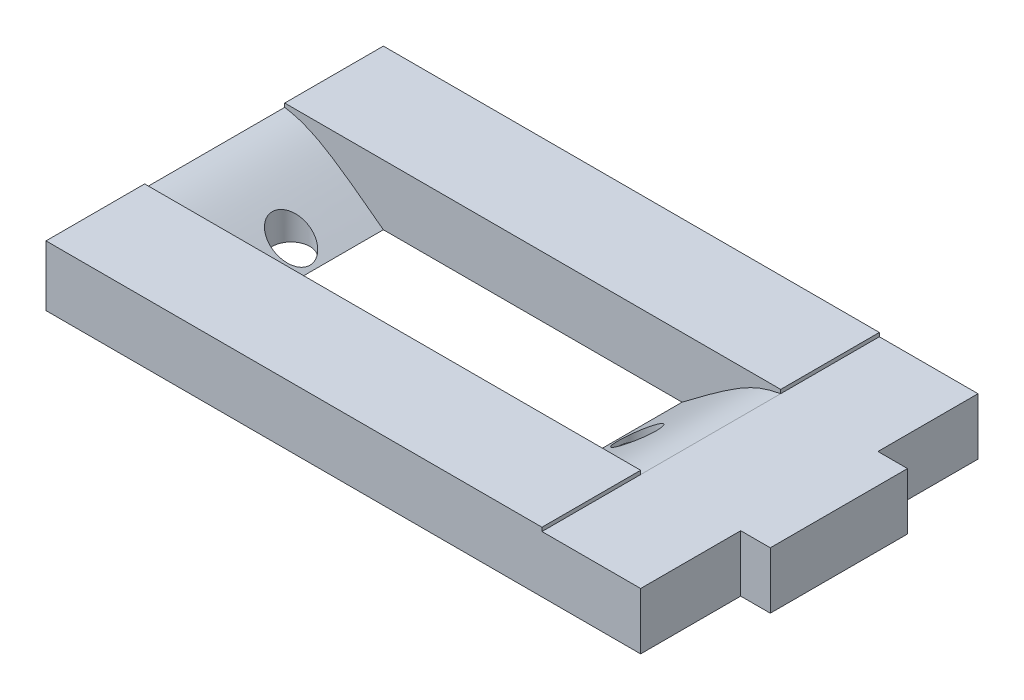
ISO-10303-21;
HEADER;
FILE_DESCRIPTION(('STEP AP214'),'2;1');
FILE_NAME('part.step','',(''),(''),'','','');
FILE_SCHEMA(('AUTOMOTIVE_DESIGN { 1 0 10303 214 1 1 1 1 }'));
ENDSEC;
DATA;
#1=APPLICATION_CONTEXT('core data for automotive mechanical design processes');
#2=APPLICATION_PROTOCOL_DEFINITION('international standard','automotive_design',2000,#1);
#3=PRODUCT_CONTEXT('',#1,'mechanical');
#4=PRODUCT('Part','Part','',(#3));
#5=PRODUCT_RELATED_PRODUCT_CATEGORY('part','',(#4));
#6=PRODUCT_DEFINITION_FORMATION('','',#4);
#7=PRODUCT_DEFINITION_CONTEXT('part definition',#1,'design');
#8=PRODUCT_DEFINITION('design','',#6,#7);
#9=PRODUCT_DEFINITION_SHAPE('','',#8);
#10=(LENGTH_UNIT() NAMED_UNIT(*) SI_UNIT(.MILLI.,.METRE.));
#11=(NAMED_UNIT(*) PLANE_ANGLE_UNIT() SI_UNIT($,.RADIAN.));
#12=(NAMED_UNIT(*) SI_UNIT($,.STERADIAN.) SOLID_ANGLE_UNIT());
#13=UNCERTAINTY_MEASURE_WITH_UNIT(LENGTH_MEASURE(1.E-05),#10,'distance_accuracy_value','');
#14=(GEOMETRIC_REPRESENTATION_CONTEXT(3) GLOBAL_UNCERTAINTY_ASSIGNED_CONTEXT((#13)) GLOBAL_UNIT_ASSIGNED_CONTEXT((#10,
#11,#12)) REPRESENTATION_CONTEXT('',''));
#15=CARTESIAN_POINT('',(0.,0.,0.));
#16=DIRECTION('',(0.,0.,1.));
#17=DIRECTION('',(1.,0.,0.));
#18=AXIS2_PLACEMENT_3D('',#15,#16,#17);
#19=CARTESIAN_POINT('',(35.14,0.,0.));
#20=DIRECTION('',(1.,0.,0.));
#21=DIRECTION('',(0.,0.,-1.));
#22=AXIS2_PLACEMENT_3D('',#19,#20,#21);
#23=PLANE('',#22);
#24=DIRECTION('',(0.,1.,0.));
#25=VECTOR('',#24,1.);
#26=CARTESIAN_POINT('',(35.14,5.74573636502059,-6.955));
#27=LINE('',#26,#25);
#28=CARTESIAN_POINT('',(35.14,0.,-6.955));
#29=VERTEX_POINT('',#28);
#30=CARTESIAN_POINT('',(35.14,5.74573636502059,-6.955));
#31=VERTEX_POINT('',#30);
#32=EDGE_CURVE('E215',#29,#31,#27,.T.);
#33=ORIENTED_EDGE('',*,*,#32,.F.);
#34=DIRECTION('',(0.,0.,-1.));
#35=VECTOR('',#34,1.);
#36=CARTESIAN_POINT('',(35.14,0.,17.1));
#37=LINE('',#36,#35);
#38=CARTESIAN_POINT('',(35.14,0.,-17.1));
#39=VERTEX_POINT('',#38);
#40=EDGE_CURVE('E227',#29,#39,#37,.T.);
#41=ORIENTED_EDGE('',*,*,#40,.T.);
#42=DIRECTION('',(0.,1.,0.));
#43=VECTOR('',#42,1.);
#44=CARTESIAN_POINT('',(35.14,0.,-17.1));
#45=LINE('',#44,#43);
#46=CARTESIAN_POINT('',(35.14,5.74573636502059,-17.1));
#47=VERTEX_POINT('',#46);
#48=EDGE_CURVE('E230',#39,#47,#45,.T.);
#49=ORIENTED_EDGE('',*,*,#48,.T.);
#50=DIRECTION('',(0.,0.,1.));
#51=VECTOR('',#50,1.);
#52=CARTESIAN_POINT('',(35.14,5.74573636502059,17.1));
#53=LINE('',#52,#51);
#54=EDGE_CURVE('E98',#47,#31,#53,.T.);
#55=ORIENTED_EDGE('',*,*,#54,.T.);
#56=EDGE_LOOP('',(#33,#41,#49,#55));
#57=FACE_BOUND('',#56,.T.);
#58=ADVANCED_FACE('F68',(#57),#23,.T.);
#59=DIRECTION('',(0.,-1.,0.));
#60=VECTOR('',#59,1.);
#61=CARTESIAN_POINT('',(35.14,5.74573636502059,6.955));
#62=LINE('',#61,#60);
#63=CARTESIAN_POINT('',(35.14,5.74573636502059,6.955));
#64=VERTEX_POINT('',#63);
#65=CARTESIAN_POINT('',(35.14,0.,6.955));
#66=VERTEX_POINT('',#65);
#67=EDGE_CURVE('E90',#64,#66,#62,.T.);
#68=ORIENTED_EDGE('',*,*,#67,.F.);
#69=CARTESIAN_POINT('',(35.14,5.74573636502059,17.1));
#70=VERTEX_POINT('',#69);
#71=EDGE_CURVE('E232',#64,#70,#53,.T.);
#72=ORIENTED_EDGE('',*,*,#71,.T.);
#73=DIRECTION('',(0.,-1.,0.));
#74=VECTOR('',#73,1.);
#75=CARTESIAN_POINT('',(35.14,0.,17.1));
#76=LINE('',#75,#74);
#77=CARTESIAN_POINT('',(35.14,0.,17.1));
#78=VERTEX_POINT('',#77);
#79=EDGE_CURVE('E224',#70,#78,#76,.T.);
#80=ORIENTED_EDGE('',*,*,#79,.T.);
#81=EDGE_CURVE('E228',#78,#66,#37,.T.);
#82=ORIENTED_EDGE('',*,*,#81,.T.);
#83=EDGE_LOOP('',(#68,#72,#80,#82));
#84=FACE_BOUND('',#83,.T.);
#85=ADVANCED_FACE('F431',(#84),#23,.T.);
#86=CARTESIAN_POINT('',(25.14,12.25,-7.1));
#87=DIRECTION('',(-1.,0.,0.));
#88=DIRECTION('',(0.,0.,1.));
#89=AXIS2_PLACEMENT_3D('',#86,#87,#88);
#90=PLANE('',#89);
#91=DIRECTION('',(0.,0.,1.));
#92=VECTOR('',#91,1.);
#93=CARTESIAN_POINT('',(25.14,5.74573636502059,17.1));
#94=LINE('',#93,#92);
#95=CARTESIAN_POINT('',(25.14,5.74573636502059,-17.1));
#96=VERTEX_POINT('',#95);
#97=CARTESIAN_POINT('',(25.14,5.74573636502059,-7.1));
#98=VERTEX_POINT('',#97);
#99=EDGE_CURVE('E218',#96,#98,#94,.T.);
#100=ORIENTED_EDGE('',*,*,#99,.F.);
#101=DIRECTION('',(0.,-1.,0.));
#102=VECTOR('',#101,1.);
#103=CARTESIAN_POINT('',(25.14,12.25,-17.1));
#104=LINE('',#103,#102);
#105=CARTESIAN_POINT('',(25.14,6.125,-17.1));
#106=VERTEX_POINT('',#105);
#107=EDGE_CURVE('E275',#106,#96,#104,.T.);
#108=ORIENTED_EDGE('',*,*,#107,.F.);
#109=DIRECTION('',(0.,0.,1.));
#110=VECTOR('',#109,1.);
#111=CARTESIAN_POINT('',(25.14,6.125,-7.1));
#112=LINE('',#111,#110);
#113=CARTESIAN_POINT('',(25.14,6.125,-7.1));
#114=VERTEX_POINT('',#113);
#115=EDGE_CURVE('E423',#106,#114,#112,.T.);
#116=ORIENTED_EDGE('',*,*,#115,.T.);
#117=CARTESIAN_POINT('',(25.14,6.125,-7.1));
#118=DIRECTION('',(0.,-1.,0.));
#119=VECTOR('',#118,1.);
#120=LINE('',#117,#119);
#121=EDGE_CURVE('E568',#114,#98,#120,.T.);
#122=ORIENTED_EDGE('',*,*,#121,.T.);
#123=EDGE_LOOP('',(#100,#108,#116,#122));
#124=FACE_BOUND('',#123,.T.);
#125=ADVANCED_FACE('F357',(#124),#90,.F.);
#126=CARTESIAN_POINT('',(25.14,5.74573636502059,7.1));
#127=VERTEX_POINT('',#126);
#128=CARTESIAN_POINT('',(25.14,5.74573636502059,17.1));
#129=VERTEX_POINT('',#128);
#130=EDGE_CURVE('E216',#127,#129,#94,.T.);
#131=ORIENTED_EDGE('',*,*,#130,.F.);
#132=CARTESIAN_POINT('',(25.14,5.74573636502059,7.1));
#133=DIRECTION('',(0.,1.,0.));
#134=VECTOR('',#133,1.);
#135=LINE('',#132,#134);
#136=CARTESIAN_POINT('',(25.14,6.125,7.1));
#137=VERTEX_POINT('',#136);
#138=EDGE_CURVE('E619',#127,#137,#135,.T.);
#139=ORIENTED_EDGE('',*,*,#138,.T.);
#140=CARTESIAN_POINT('',(25.14,6.125,17.1));
#141=VERTEX_POINT('',#140);
#142=EDGE_CURVE('E262',#137,#141,#112,.T.);
#143=ORIENTED_EDGE('',*,*,#142,.T.);
#144=DIRECTION('',(0.,-1.,0.));
#145=VECTOR('',#144,1.);
#146=CARTESIAN_POINT('',(25.14,12.25,17.1));
#147=LINE('',#146,#145);
#148=EDGE_CURVE('E255',#141,#129,#147,.T.);
#149=ORIENTED_EDGE('',*,*,#148,.T.);
#150=EDGE_LOOP('',(#131,#139,#143,#149));
#151=FACE_BOUND('',#150,.T.);
#152=ADVANCED_FACE('F258',(#151),#90,.F.);
#153=CARTESIAN_POINT('',(24.2045446236148,6.125,25.25));
#154=DIRECTION('',(0.,-1.,0.));
#155=DIRECTION('',(0.,0.,-1.));
#156=AXIS2_PLACEMENT_3D('',#153,#154,#155);
#157=PLANE('',#156);
#158=ORIENTED_EDGE('',*,*,#142,.F.);
#159=DIRECTION('',(-1.,0.,0.));
#160=VECTOR('',#159,1.);
#161=CARTESIAN_POINT('',(-15.14,6.125,7.1));
#162=LINE('',#161,#160);
#163=CARTESIAN_POINT('',(-25.14,6.125,7.1));
#164=VERTEX_POINT('',#163);
#165=EDGE_CURVE('E278',#137,#164,#162,.T.);
#166=ORIENTED_EDGE('',*,*,#165,.T.);
#167=DIRECTION('',(0.,0.,-1.));
#168=VECTOR('',#167,1.);
#169=CARTESIAN_POINT('',(-25.14,6.125,25.25));
#170=LINE('',#169,#168);
#171=CARTESIAN_POINT('',(-25.14,6.125,17.1));
#172=VERTEX_POINT('',#171);
#173=EDGE_CURVE('E279',#172,#164,#170,.T.);
#174=ORIENTED_EDGE('',*,*,#173,.F.);
#175=DIRECTION('',(-1.,0.,0.));
#176=VECTOR('',#175,1.);
#177=CARTESIAN_POINT('',(-15.14,6.125,17.1));
#178=LINE('',#177,#176);
#179=EDGE_CURVE('E291',#141,#172,#178,.T.);
#180=ORIENTED_EDGE('',*,*,#179,.F.);
#181=EDGE_LOOP('',(#158,#166,#174,#180));
#182=FACE_BOUND('',#181,.T.);
#183=ADVANCED_FACE('F312',(#182),#157,.F.);
#184=CARTESIAN_POINT('',(0.,0.,0.));
#185=DIRECTION('',(0.,1.,0.));
#186=DIRECTION('',(0.,0.,1.));
#187=AXIS2_PLACEMENT_3D('',#184,#185,#186);
#188=PLANE('',#187);
#189=DIRECTION('',(-1.,0.,0.));
#190=VECTOR('',#189,1.);
#191=CARTESIAN_POINT('',(-15.14,0.,-7.1));
#192=LINE('',#191,#190);
#193=CARTESIAN_POINT('',(15.14,0.,-7.1));
#194=VERTEX_POINT('',#193);
#195=CARTESIAN_POINT('',(-15.14,0.,-7.1));
#196=VERTEX_POINT('',#195);
#197=EDGE_CURVE('E493',#194,#196,#192,.T.);
#198=ORIENTED_EDGE('',*,*,#197,.T.);
#199=CARTESIAN_POINT('',(-15.14,0.,7.80999999999999));
#200=CARTESIAN_POINT('',(-15.14,0.,2.60333333333332));
#201=CARTESIAN_POINT('',(-15.14,0.,-2.60333333333333));
#202=CARTESIAN_POINT('',(-15.14,0.,-7.81));
#203=(BOUNDED_CURVE() B_SPLINE_CURVE(3,(#199,#200,#201,#202),.UNSPECIFIED.,.F.,
.F.) B_SPLINE_CURVE_WITH_KNOTS((4,4),(-0.03306,-0.01744),
.UNSPECIFIED.) CURVE() GEOMETRIC_REPRESENTATION_ITEM() RATIONAL_B_SPLINE_CURVE((1.,1.,1.,1.)) REPRESENTATION_ITEM(''));
#204=CARTESIAN_POINT('',(-15.14,0.,7.1));
#205=VERTEX_POINT('',#204);
#206=EDGE_CURVE('E494',#196,#205,#203,.F.);
#207=ORIENTED_EDGE('',*,*,#206,.T.);
#208=DIRECTION('',(1.,0.,0.));
#209=VECTOR('',#208,1.);
#210=CARTESIAN_POINT('',(-15.14,0.,7.1));
#211=LINE('',#210,#209);
#212=CARTESIAN_POINT('',(15.14,0.,7.1));
#213=VERTEX_POINT('',#212);
#214=EDGE_CURVE('E296',#205,#213,#211,.T.);
#215=ORIENTED_EDGE('',*,*,#214,.T.);
#216=CARTESIAN_POINT('',(15.14,0.,-7.81));
#217=CARTESIAN_POINT('',(15.14,0.,-2.60333333333333));
#218=CARTESIAN_POINT('',(15.14,0.,2.60333333333334));
#219=CARTESIAN_POINT('',(15.14,0.,7.81000000000001));
#220=(BOUNDED_CURVE() B_SPLINE_CURVE(3,(#216,#217,#218,#219),.UNSPECIFIED.,.F.,
.F.) B_SPLINE_CURVE_WITH_KNOTS((4,4),(-0.01491,0.000710000000000001),
.UNSPECIFIED.) CURVE() GEOMETRIC_REPRESENTATION_ITEM() RATIONAL_B_SPLINE_CURVE((1.,1.,1.,1.)) REPRESENTATION_ITEM(''));
#221=CARTESIAN_POINT('',(15.14,0.,6.955));
#222=VERTEX_POINT('',#221);
#223=EDGE_CURVE('E488',#213,#222,#220,.F.);
#224=ORIENTED_EDGE('',*,*,#223,.T.);
#225=CARTESIAN_POINT('',(15.14,0.,-7.81));
#226=CARTESIAN_POINT('',(15.14,0.,-2.60333333333333));
#227=CARTESIAN_POINT('',(15.14,0.,2.60333333333334));
#228=CARTESIAN_POINT('',(15.14,0.,7.81000000000001));
#229=(BOUNDED_CURVE() B_SPLINE_CURVE(3,(#225,#226,#227,#228),.UNSPECIFIED.,.F.,
.F.) B_SPLINE_CURVE_WITH_KNOTS((4,4),(-0.01491,0.000710000000000001),
.UNSPECIFIED.) CURVE() GEOMETRIC_REPRESENTATION_ITEM() RATIONAL_B_SPLINE_CURVE((1.,1.,1.,1.)) REPRESENTATION_ITEM(''));
#230=CARTESIAN_POINT('',(15.14,0.,-6.955));
#231=VERTEX_POINT('',#230);
#232=EDGE_CURVE('E452',#222,#231,#229,.F.);
#233=ORIENTED_EDGE('',*,*,#232,.T.);
#234=CARTESIAN_POINT('',(15.14,0.,-7.81));
#235=CARTESIAN_POINT('',(15.14,0.,-2.60333333333333));
#236=CARTESIAN_POINT('',(15.14,0.,2.60333333333334));
#237=CARTESIAN_POINT('',(15.14,0.,7.81000000000001));
#238=(BOUNDED_CURVE() B_SPLINE_CURVE(3,(#234,#235,#236,#237),.UNSPECIFIED.,.F.,
.F.) B_SPLINE_CURVE_WITH_KNOTS((4,4),(-0.01491,0.000710000000000001),
.UNSPECIFIED.) CURVE() GEOMETRIC_REPRESENTATION_ITEM() RATIONAL_B_SPLINE_CURVE((1.,1.,1.,1.)) REPRESENTATION_ITEM(''));
#239=EDGE_CURVE('E294',#231,#194,#238,.F.);
#240=ORIENTED_EDGE('',*,*,#239,.T.);
#241=EDGE_LOOP('',(#198,#207,#215,#224,#233,#240));
#242=FACE_BOUND('',#241,.T.);
#243=DIRECTION('',(-1.,0.,0.));
#244=VECTOR('',#243,1.);
#245=CARTESIAN_POINT('',(-15.14,0.,-17.1));
#246=LINE('',#245,#244);
#247=CARTESIAN_POINT('',(-25.14,0.,-17.1));
#248=VERTEX_POINT('',#247);
#249=EDGE_CURVE('E295',#39,#248,#246,.T.);
#250=ORIENTED_EDGE('',*,*,#249,.F.);
#251=ORIENTED_EDGE('',*,*,#40,.F.);
#252=DIRECTION('',(-1.,0.,0.));
#253=VECTOR('',#252,1.);
#254=CARTESIAN_POINT('',(38.14,0.,-6.955));
#255=LINE('',#254,#253);
#256=CARTESIAN_POINT('',(38.14,0.,-6.955));
#257=VERTEX_POINT('',#256);
#258=EDGE_CURVE('E649',#257,#29,#255,.T.);
#259=ORIENTED_EDGE('',*,*,#258,.F.);
#260=DIRECTION('',(0.,0.,-1.));
#261=VECTOR('',#260,1.);
#262=CARTESIAN_POINT('',(38.14,0.,6.955));
#263=LINE('',#262,#261);
#264=CARTESIAN_POINT('',(38.14,0.,6.955));
#265=VERTEX_POINT('',#264);
#266=EDGE_CURVE('E209',#265,#257,#263,.T.);
#267=ORIENTED_EDGE('',*,*,#266,.F.);
#268=DIRECTION('',(-1.,0.,0.));
#269=VECTOR('',#268,1.);
#270=CARTESIAN_POINT('',(38.14,0.,6.955));
#271=LINE('',#270,#269);
#272=EDGE_CURVE('E220',#265,#66,#271,.T.);
#273=ORIENTED_EDGE('',*,*,#272,.T.);
#274=ORIENTED_EDGE('',*,*,#81,.F.);
#275=DIRECTION('',(1.,0.,0.));
#276=VECTOR('',#275,1.);
#277=CARTESIAN_POINT('',(-15.14,0.,17.1));
#278=LINE('',#277,#276);
#279=CARTESIAN_POINT('',(-25.14,0.,17.1));
#280=VERTEX_POINT('',#279);
#281=EDGE_CURVE('E265',#280,#78,#278,.T.);
#282=ORIENTED_EDGE('',*,*,#281,.F.);
#283=DIRECTION('',(0.,0.,1.));
#284=VECTOR('',#283,1.);
#285=CARTESIAN_POINT('',(-25.14,0.,-7.1));
#286=LINE('',#285,#284);
#287=EDGE_CURVE('E269',#248,#280,#286,.T.);
#288=ORIENTED_EDGE('',*,*,#287,.F.);
#289=EDGE_LOOP('',(#250,#251,#259,#267,#273,#274,#282,#288));
#290=FACE_BOUND('',#289,.T.);
#291=CARTESIAN_POINT('',(-17.395,0.,0.));
#292=DIRECTION('',(0.,1.,0.));
#293=DIRECTION('',(0.,0.,1.));
#294=AXIS2_PLACEMENT_3D('',#291,#292,#293);
#295=CIRCLE('',#294,1.91);
#296=CARTESIAN_POINT('',(-17.395,0.,1.91));
#297=VERTEX_POINT('',#296);
#298=EDGE_CURVE('E420',#297,#297,#295,.T.);
#299=ORIENTED_EDGE('',*,*,#298,.T.);
#300=EDGE_LOOP('',(#299));
#301=FACE_BOUND('',#300,.T.);
#302=CARTESIAN_POINT('',(17.69,0.,0.));
#303=DIRECTION('',(0.,1.,0.));
#304=DIRECTION('',(0.,0.,1.));
#305=AXIS2_PLACEMENT_3D('',#302,#303,#304);
#306=CIRCLE('',#305,1.91);
#307=CARTESIAN_POINT('',(17.69,0.,1.91));
#308=VERTEX_POINT('',#307);
#309=EDGE_CURVE('E242',#308,#308,#306,.F.);
#310=ORIENTED_EDGE('',*,*,#309,.F.);
#311=EDGE_LOOP('',(#310));
#312=FACE_BOUND('',#311,.T.);
#313=ADVANCED_FACE('F308',(#242,#290,#301,#312),#188,.F.);
#314=CARTESIAN_POINT('',(-15.14,12.25,-17.1));
#315=DIRECTION('',(0.,0.,1.));
#316=DIRECTION('',(1.,0.,0.));
#317=AXIS2_PLACEMENT_3D('',#314,#315,#316);
#318=PLANE('',#317);
#319=DIRECTION('',(-1.,0.,0.));
#320=VECTOR('',#319,1.);
#321=CARTESIAN_POINT('',(24.2045446236148,6.125,-17.1));
#322=LINE('',#321,#320);
#323=CARTESIAN_POINT('',(-25.14,6.125,-17.1));
#324=VERTEX_POINT('',#323);
#325=EDGE_CURVE('E289',#106,#324,#322,.T.);
#326=ORIENTED_EDGE('',*,*,#325,.F.);
#327=ORIENTED_EDGE('',*,*,#107,.T.);
#328=DIRECTION('',(-1.,0.,0.));
#329=VECTOR('',#328,1.);
#330=CARTESIAN_POINT('',(35.14,5.74573636502059,-17.1));
#331=LINE('',#330,#329);
#332=EDGE_CURVE('E241',#47,#96,#331,.T.);
#333=ORIENTED_EDGE('',*,*,#332,.F.);
#334=ORIENTED_EDGE('',*,*,#48,.F.);
#335=ORIENTED_EDGE('',*,*,#249,.T.);
#336=DIRECTION('',(0.,-1.,0.));
#337=VECTOR('',#336,1.);
#338=CARTESIAN_POINT('',(-25.14,12.25,-17.1));
#339=LINE('',#338,#337);
#340=EDGE_CURVE('E267',#324,#248,#339,.T.);
#341=ORIENTED_EDGE('',*,*,#340,.F.);
#342=EDGE_LOOP('',(#326,#327,#333,#334,#335,#341));
#343=FACE_BOUND('',#342,.T.);
#344=ADVANCED_FACE('F465',(#343),#318,.F.);
#345=CARTESIAN_POINT('',(-25.14,12.25,-7.1));
#346=DIRECTION('',(1.,0.,0.));
#347=DIRECTION('',(0.,0.,-1.));
#348=AXIS2_PLACEMENT_3D('',#345,#346,#347);
#349=PLANE('',#348);
#350=CARTESIAN_POINT('',(-25.14,5.7457363650206,-7.81));
#351=CARTESIAN_POINT('',(-25.14,5.7457363650206,-2.60333333333334));
#352=CARTESIAN_POINT('',(-25.14,5.7457363650206,2.60333333333333));
#353=CARTESIAN_POINT('',(-25.14,5.7457363650206,7.80999999999999));
#354=(BOUNDED_CURVE() B_SPLINE_CURVE(3,(#350,#351,#352,#353),.UNSPECIFIED.,.F.,
.F.) B_SPLINE_CURVE_WITH_KNOTS((4,4),(-0.03306,-0.01744),
.UNSPECIFIED.) CURVE() GEOMETRIC_REPRESENTATION_ITEM() RATIONAL_B_SPLINE_CURVE((1.82212779451616,
1.82212779451616,1.82212779451616,1.82212779451616)) REPRESENTATION_ITEM(''));
#355=CARTESIAN_POINT('',(-25.14,5.7457363650206,7.1));
#356=VERTEX_POINT('',#355);
#357=CARTESIAN_POINT('',(-25.14,5.7457363650206,-7.1));
#358=VERTEX_POINT('',#357);
#359=EDGE_CURVE('E318',#356,#358,#354,.F.);
#360=ORIENTED_EDGE('',*,*,#359,.T.);
#361=CARTESIAN_POINT('',(-25.14,5.7457363650206,-7.1));
#362=DIRECTION('',(0.,1.,0.));
#363=VECTOR('',#362,1.);
#364=LINE('',#361,#363);
#365=CARTESIAN_POINT('',(-25.14,6.125,-7.1));
#366=VERTEX_POINT('',#365);
#367=EDGE_CURVE('E335',#358,#366,#364,.T.);
#368=ORIENTED_EDGE('',*,*,#367,.T.);
#369=EDGE_CURVE('E284',#366,#324,#170,.T.);
#370=ORIENTED_EDGE('',*,*,#369,.T.);
#371=ORIENTED_EDGE('',*,*,#340,.T.);
#372=ORIENTED_EDGE('',*,*,#287,.T.);
#373=DIRECTION('',(0.,-1.,0.));
#374=VECTOR('',#373,1.);
#375=CARTESIAN_POINT('',(-25.14,12.25,17.1));
#376=LINE('',#375,#374);
#377=EDGE_CURVE('E264',#172,#280,#376,.T.);
#378=ORIENTED_EDGE('',*,*,#377,.F.);
#379=ORIENTED_EDGE('',*,*,#173,.T.);
#380=CARTESIAN_POINT('',(-25.14,6.125,7.1));
#381=DIRECTION('',(0.,-1.,0.));
#382=VECTOR('',#381,1.);
#383=LINE('',#380,#382);
#384=EDGE_CURVE('E315',#164,#356,#383,.T.);
#385=ORIENTED_EDGE('',*,*,#384,.T.);
#386=EDGE_LOOP('',(#360,#368,#370,#371,#372,#378,#379,#385));
#387=FACE_BOUND('',#386,.T.);
#388=ADVANCED_FACE('F303',(#387),#349,.F.);
#389=CARTESIAN_POINT('',(-15.14,12.25,17.1));
#390=DIRECTION('',(0.,0.,-1.));
#391=DIRECTION('',(-1.,0.,0.));
#392=AXIS2_PLACEMENT_3D('',#389,#390,#391);
#393=PLANE('',#392);
#394=ORIENTED_EDGE('',*,*,#148,.F.);
#395=ORIENTED_EDGE('',*,*,#179,.T.);
#396=ORIENTED_EDGE('',*,*,#377,.T.);
#397=ORIENTED_EDGE('',*,*,#281,.T.);
#398=ORIENTED_EDGE('',*,*,#79,.F.);
#399=DIRECTION('',(-1.,0.,0.));
#400=VECTOR('',#399,1.);
#401=CARTESIAN_POINT('',(35.14,5.74573636502059,17.1));
#402=LINE('',#401,#400);
#403=EDGE_CURVE('E234',#70,#129,#402,.T.);
#404=ORIENTED_EDGE('',*,*,#403,.T.);
#405=EDGE_LOOP('',(#394,#395,#396,#397,#398,#404));
#406=FACE_BOUND('',#405,.T.);
#407=ADVANCED_FACE('F253',(#406),#393,.F.);
#408=CARTESIAN_POINT('',(-15.14,12.25,-7.1));
#409=DIRECTION('',(0.,0.,1.));
#410=DIRECTION('',(1.,0.,0.));
#411=AXIS2_PLACEMENT_3D('',#408,#409,#410);
#412=PLANE('',#411);
#413=DIRECTION('',(1.,0.,0.));
#414=VECTOR('',#413,1.);
#415=CARTESIAN_POINT('',(-15.14,6.125,-7.1));
#416=LINE('',#415,#414);
#417=EDGE_CURVE('E283',#366,#114,#416,.T.);
#418=ORIENTED_EDGE('',*,*,#417,.F.);
#419=ORIENTED_EDGE('',*,*,#367,.F.);
#420=CARTESIAN_POINT('',(-15.14,0.,-7.1));
#421=CARTESIAN_POINT('',(-23.1901279874825,6.12500000000001,-7.1));
#422=CARTESIAN_POINT('',(-33.3054720555234,6.125,-7.1));
#423=(BOUNDED_CURVE() B_SPLINE_CURVE(2,(#420,#421,#422),.UNSPECIFIED.,.F.,
.F.) B_SPLINE_CURVE_WITH_KNOTS((3,3),(0.,1.),
.UNSPECIFIED.) CURVE() GEOMETRIC_REPRESENTATION_ITEM() RATIONAL_B_SPLINE_CURVE((1.,
2.84275394643996,1.)) REPRESENTATION_ITEM(''));
#424=EDGE_CURVE('E333',#358,#196,#423,.F.);
#425=ORIENTED_EDGE('',*,*,#424,.T.);
#426=ORIENTED_EDGE('',*,*,#197,.F.);
#427=CARTESIAN_POINT('',(33.3054720555234,6.125,-7.1));
#428=CARTESIAN_POINT('',(23.1901279874825,6.125,-7.1));
#429=CARTESIAN_POINT('',(15.14,0.,-7.1));
#430=(BOUNDED_CURVE() B_SPLINE_CURVE(2,(#427,#428,#429),.UNSPECIFIED.,.F.,
.F.) B_SPLINE_CURVE_WITH_KNOTS((3,3),(0.,1.),
.UNSPECIFIED.) CURVE() GEOMETRIC_REPRESENTATION_ITEM() RATIONAL_B_SPLINE_CURVE((1.,
2.84275394643997,1.)) REPRESENTATION_ITEM(''));
#431=EDGE_CURVE('E13',#194,#98,#430,.F.);
#432=ORIENTED_EDGE('',*,*,#431,.T.);
#433=ORIENTED_EDGE('',*,*,#121,.F.);
#434=EDGE_LOOP('',(#418,#419,#425,#426,#432,#433));
#435=FACE_BOUND('',#434,.T.);
#436=ADVANCED_FACE('F466',(#435),#412,.T.);
#437=CARTESIAN_POINT('',(-15.14,12.25,7.1));
#438=DIRECTION('',(0.,0.,-1.));
#439=DIRECTION('',(-1.,0.,0.));
#440=AXIS2_PLACEMENT_3D('',#437,#438,#439);
#441=PLANE('',#440);
#442=ORIENTED_EDGE('',*,*,#165,.F.);
#443=ORIENTED_EDGE('',*,*,#138,.F.);
#444=CARTESIAN_POINT('',(15.14,0.,7.1));
#445=CARTESIAN_POINT('',(23.1901279874825,6.125,7.1));
#446=CARTESIAN_POINT('',(33.3054720555234,6.125,7.1));
#447=(BOUNDED_CURVE() B_SPLINE_CURVE(2,(#444,#445,#446),.UNSPECIFIED.,.F.,
.F.) B_SPLINE_CURVE_WITH_KNOTS((3,3),(0.,1.),
.UNSPECIFIED.) CURVE() GEOMETRIC_REPRESENTATION_ITEM() RATIONAL_B_SPLINE_CURVE((1.,
2.84275394643997,1.)) REPRESENTATION_ITEM(''));
#448=EDGE_CURVE('E83',#127,#213,#447,.F.);
#449=ORIENTED_EDGE('',*,*,#448,.T.);
#450=ORIENTED_EDGE('',*,*,#214,.F.);
#451=CARTESIAN_POINT('',(-33.3054720555234,6.125,7.1));
#452=CARTESIAN_POINT('',(-23.1901279874825,6.125,7.1));
#453=CARTESIAN_POINT('',(-15.14,0.,7.1));
#454=(BOUNDED_CURVE() B_SPLINE_CURVE(2,(#451,#452,#453),.UNSPECIFIED.,.F.,
.F.) B_SPLINE_CURVE_WITH_KNOTS((3,3),(0.,1.),
.UNSPECIFIED.) CURVE() GEOMETRIC_REPRESENTATION_ITEM() RATIONAL_B_SPLINE_CURVE((1.,
2.84275394643997,1.)) REPRESENTATION_ITEM(''));
#455=EDGE_CURVE('E329',#205,#356,#454,.F.);
#456=ORIENTED_EDGE('',*,*,#455,.T.);
#457=ORIENTED_EDGE('',*,*,#384,.F.);
#458=EDGE_LOOP('',(#442,#443,#449,#450,#456,#457));
#459=FACE_BOUND('',#458,.T.);
#460=ADVANCED_FACE('F574',(#459),#441,.T.);
#461=ORIENTED_EDGE('',*,*,#417,.T.);
#462=ORIENTED_EDGE('',*,*,#115,.F.);
#463=ORIENTED_EDGE('',*,*,#325,.T.);
#464=ORIENTED_EDGE('',*,*,#369,.F.);
#465=EDGE_LOOP('',(#461,#462,#463,#464));
#466=FACE_BOUND('',#465,.T.);
#467=ADVANCED_FACE('F435',(#466),#157,.F.);
#468=CARTESIAN_POINT('',(17.69,-3.875,0.));
#469=DIRECTION('',(0.,1.,0.));
#470=DIRECTION('',(0.,0.,1.));
#471=AXIS2_PLACEMENT_3D('',#468,#469,#470);
#472=CYLINDRICAL_SURFACE('',#471,1.91);
#473=ORIENTED_EDGE('',*,*,#309,.T.);
#474=EDGE_LOOP('',(#473));
#475=FACE_BOUND('',#474,.T.);
#476=CARTESIAN_POINT('',(19.1354502442826,2.94009257939289,-1.24850854674818));
#477=CARTESIAN_POINT('',(19.0571912675472,2.88575639190024,-1.33910692132039));
#478=CARTESIAN_POINT('',(18.9719247220576,2.82623944902689,-1.42057408077357));
#479=CARTESIAN_POINT('',(18.7916312535237,2.69960095739968,-1.56456595256409));
#480=CARTESIAN_POINT('',(18.6965913513051,2.63246928365415,-1.62706502844282));
#481=CARTESIAN_POINT('',(18.5008563618796,2.49340511110126,-1.73288801391851));
#482=CARTESIAN_POINT('',(18.4002039775146,2.42150824112481,-1.7763390366632));
#483=CARTESIAN_POINT('',(18.1953264519625,2.27440144662804,-1.84510898476601));
#484=CARTESIAN_POINT('',(18.0911021244767,2.19919227556342,-1.87043201135212));
#485=CARTESIAN_POINT('',(17.8639694620825,2.03454034045296,-1.90607333838967));
#486=CARTESIAN_POINT('',(17.7407922858925,1.94478078878732,-1.91326166185275));
#487=CARTESIAN_POINT('',(17.4953048060538,1.765086204663,-1.90402690752113));
#488=CARTESIAN_POINT('',(17.3729957490303,1.6751510919306,-1.88757489773105));
#489=CARTESIAN_POINT('',(17.1226978388935,1.49041258196017,-1.82867218677302));
#490=CARTESIAN_POINT('',(16.9950166648359,1.39578112035336,-1.78428223977896));
#491=CARTESIAN_POINT('',(16.810348689487,1.25847113645219,-1.69674765932512));
#492=CARTESIAN_POINT('',(16.7499545635967,1.21348866484382,-1.66409266480375));
#493=CARTESIAN_POINT('',(16.6319515464471,1.12547063825517,-1.59167464993505));
#494=CARTESIAN_POINT('',(16.5743450316059,1.08243674636576,-1.55190569604242));
#495=CARTESIAN_POINT('',(16.4386223255319,0.980917716939199,-1.4465079098369));
#496=CARTESIAN_POINT('',(16.3623675727648,0.92376715972545,-1.37712100940236));
#497=CARTESIAN_POINT('',(16.2198294551416,0.816784464671739,-1.22378239694876));
#498=CARTESIAN_POINT('',(16.1535462783028,0.766952464826039,-1.13983041036438));
#499=CARTESIAN_POINT('',(16.0442164335714,0.684668753370228,-0.97348407928306));
#500=CARTESIAN_POINT('',(15.9991373498855,0.650703970537073,-0.893183127133642));
#501=CARTESIAN_POINT('',(15.9202938388403,0.591260308128985,-0.72448914246299));
#502=CARTESIAN_POINT('',(15.8865024440494,0.565761204094717,-0.636116048403705));
#503=CARTESIAN_POINT('',(15.8318758202637,0.524523853325265,-0.452427145809584));
#504=CARTESIAN_POINT('',(15.8111355389008,0.50885713995265,-0.357065968328661));
#505=CARTESIAN_POINT('',(15.7911401325274,0.493751191760163,-0.211752784869639));
#506=CARTESIAN_POINT('',(15.786327719825,0.490115061742649,-0.162921852194906));
#507=CARTESIAN_POINT('',(15.7804721234815,0.485690601035091,-0.0649038817058871));
#508=CARTESIAN_POINT('',(15.7794288893274,0.48490223218054,-0.0157168486727624));
#509=CARTESIAN_POINT('',(15.7818320720854,0.486718233206951,0.121032505802446));
#510=CARTESIAN_POINT('',(15.789426322952,0.492457048439258,0.20853177473429));
#511=CARTESIAN_POINT('',(15.8162756035713,0.512739423433833,0.380598136091806));
#512=CARTESIAN_POINT('',(15.8355303100572,0.527282739105835,0.465165309736273));
#513=CARTESIAN_POINT('',(15.8845820604056,0.564311384607625,0.629194114512739));
#514=CARTESIAN_POINT('',(15.9143654600866,0.586786435602238,0.708662196845259));
#515=CARTESIAN_POINT('',(15.9830757340925,0.63859743462548,0.861109815245029));
#516=CARTESIAN_POINT('',(16.0220054967775,0.667935549951101,0.934087291565853));
#517=CARTESIAN_POINT('',(16.1126420867215,0.736176946154035,1.08090224438647));
#518=CARTESIAN_POINT('',(16.1653201836806,0.775804556627221,1.15379874171722));
#519=CARTESIAN_POINT('',(16.2783970640946,0.860758809424993,1.28969130734664));
#520=CARTESIAN_POINT('',(16.3388045705316,0.906091889663256,1.35267600784966));
#521=CARTESIAN_POINT('',(16.4398859687231,0.981835003148213,1.44496492614399));
#522=CARTESIAN_POINT('',(16.4786432795062,1.0108528479032,1.47757846391449));
#523=CARTESIAN_POINT('',(16.5579326194429,1.07016053380766,1.53916870590959));
#524=CARTESIAN_POINT('',(16.5984626285205,1.10044892557487,1.56814941140599));
#525=CARTESIAN_POINT('',(16.7224404868805,1.19300212390541,1.64976467309377));
#526=CARTESIAN_POINT('',(16.8082339689488,1.25692331179771,1.69703442767322));
#527=CARTESIAN_POINT('',(17.0017321440488,1.40073634673695,1.78546084834881));
#528=CARTESIAN_POINT('',(17.1103819195165,1.48126128511363,1.82349319832783));
#529=CARTESIAN_POINT('',(17.3313156097261,1.64443392242767,1.87947702435298));
#530=CARTESIAN_POINT('',(17.4436019216341,1.72708301385785,1.8974149652766));
#531=CARTESIAN_POINT('',(17.6208922830382,1.85705160330606,1.90984248207178));
#532=CARTESIAN_POINT('',(17.6855266745841,1.90432504302392,1.91108819315641));
#533=CARTESIAN_POINT('',(17.8147081186364,1.99857262461248,1.90701913831764));
#534=CARTESIAN_POINT('',(17.8792551969973,2.04554700039735,1.90171036294749));
#535=CARTESIAN_POINT('',(18.0723888072568,2.18571952951043,1.87583383772064));
#536=CARTESIAN_POINT('',(18.2003958153855,2.27811433905831,1.84531077109443));
#537=CARTESIAN_POINT('',(18.452052366743,2.45864461557216,1.75653299353355));
#538=CARTESIAN_POINT('',(18.5756360221425,2.54671988861465,1.69796768232613));
#539=CARTESIAN_POINT('',(18.8115508465704,2.7137132341119,1.55220175520639));
#540=CARTESIAN_POINT('',(18.9239103740827,2.79265446860961,1.46507581637342));
#541=CARTESIAN_POINT('',(19.0962763404712,2.91294737081932,1.29609840081253));
#542=CARTESIAN_POINT('',(19.1613093872141,2.95809760322329,1.22202772849961));
#543=CARTESIAN_POINT('',(19.2807365892832,3.04066377151561,1.06188874689489));
#544=CARTESIAN_POINT('',(19.3351372678835,3.07808445052149,0.975827849836088));
#545=CARTESIAN_POINT('',(19.4308981831407,3.14372717917088,0.792551190226487));
#546=CARTESIAN_POINT('',(19.4721594613488,3.17187947593734,0.695257965509283));
#547=CARTESIAN_POINT('',(19.5383888433573,3.21696555152853,0.492815709119369));
#548=CARTESIAN_POINT('',(19.5633696240344,3.23390805905881,0.387672860865399));
#549=CARTESIAN_POINT('',(19.5931993008438,3.25412512099579,0.186875538485769));
#550=CARTESIAN_POINT('',(19.6001742226299,3.25884335101924,0.0916777110534392));
#551=CARTESIAN_POINT('',(19.5998193968587,3.25860329788826,-0.0986602736132984));
#552=CARTESIAN_POINT('',(19.5924953754527,3.25364888823689,-0.193800438677137));
#553=CARTESIAN_POINT('',(19.5649032844022,3.23494665304504,-0.375139326743654));
#554=CARTESIAN_POINT('',(19.5454674924246,3.22176414602235,-0.461526370661211));
#555=CARTESIAN_POINT('',(19.4954462595369,3.18774270901744,-0.629395487966871));
#556=CARTESIAN_POINT('',(19.4648598445034,3.16690311010708,-0.710877132092291));
#557=CARTESIAN_POINT('',(19.390695340466,3.11619582609687,-0.874359962718034));
#558=CARTESIAN_POINT('',(19.3461904653237,3.08568068792622,-0.955737848532288));
#559=CARTESIAN_POINT('',(19.247561351702,3.01775965998603,-1.10925592642322));
#560=CARTESIAN_POINT('',(19.1934289142463,2.9803478959474,-1.18138815394878));
#561=CARTESIAN_POINT('',(19.1354502442826,2.94009257939289,-1.24850854674818));
#562=B_SPLINE_CURVE_WITH_KNOTS('',3,(#476,#477,#478,#479,#480,#481,#482,#483,#484,#485,#486,
#487,#488,#489,#490,#491,#492,#493,#494,#495,#496,#497,#498,#499,#500,#501,#502,#503,#504,#505,
#506,#507,#508,#509,#510,#511,#512,#513,#514,#515,#516,#517,#518,#519,#520,#521,#522,#523,#524,
#525,#526,#527,#528,#529,#530,#531,#532,#533,#534,#535,#536,#537,#538,#539,#540,#541,#542,#543,
#544,#545,#546,#547,#548,#549,#550,#551,#552,#553,#554,#555,#556,#557,#558,#559,#560,#561),
.UNSPECIFIED.,.T.,.F.,(4,2,2,2,2,2,2,2,2,2,2,2,2,2,2,2,2,2,2,2,2,2,2,2,2,2,2,2,2,2,2,2,2,2,2,2,
2,2,2,2,2,2,4),(0.,0.394000266287033,0.788530699211737,1.18038667855705,1.57215397744231,
2.02797123864697,2.48434682279038,2.97654262702678,3.22247164755557,3.46860675491046,
3.82082664400914,4.17305317349923,4.4662960872034,4.7588333177754,5.05347489029619,
5.20088205120567,5.34828723661852,5.61093833092621,5.87358214399856,6.13588683599026,
6.398274473647,6.69204294063675,6.98614591176345,7.1611336170261,7.33592686159392,
7.68570650524983,8.10559444338812,8.52576503844793,8.7657813070513,9.00557837213864,
9.48543723784371,9.97073856483687,10.4547809695001,10.7787805169654,11.1025806527199,
11.4287647512931,11.7546945608518,12.0398863177726,12.324963890294,12.5923338686788,
12.8597272102203,13.1513752886187,13.4432729386717),.UNSPECIFIED.);
#563=CARTESIAN_POINT('',(19.1354502442826,2.94009257939289,-1.24850854674818));
#564=VERTEX_POINT('',#563);
#565=EDGE_CURVE('E439',#564,#564,#562,.T.);
#566=ORIENTED_EDGE('',*,*,#565,.T.);
#567=EDGE_LOOP('',(#566));
#568=FACE_BOUND('',#567,.T.);
#569=ADVANCED_FACE('F429',(#475,#568),#472,.F.);
#570=CARTESIAN_POINT('',(-17.395,-3.875,0.));
#571=DIRECTION('',(0.,1.,0.));
#572=DIRECTION('',(0.,0.,1.));
#573=AXIS2_PLACEMENT_3D('',#570,#571,#572);
#574=CYLINDRICAL_SURFACE('',#573,1.91);
#575=CARTESIAN_POINT('',(-18.8802914145276,2.76187598633361,-1.20083696392584));
#576=CARTESIAN_POINT('',(-18.9376016335813,2.80213354104443,-1.12994627620348));
#577=CARTESIAN_POINT('',(-18.9907550200177,2.8393209048686,-1.05380084176372));
#578=CARTESIAN_POINT('',(-19.086535205554,2.90612833626291,-0.891995391368158));
#579=CARTESIAN_POINT('',(-19.1291517159098,2.93574100848427,-0.80632619329167));
#580=CARTESIAN_POINT('',(-19.2018430969959,2.98613712001984,-0.62676691963287));
#581=CARTESIAN_POINT('',(-19.2318519180612,3.00687407121982,-0.532836592243066));
#582=CARTESIAN_POINT('',(-19.2771223527297,3.03811921723063,-0.339877792421866));
#583=CARTESIAN_POINT('',(-19.2923954952535,3.04863540862114,-0.240853369516754));
#584=CARTESIAN_POINT('',(-19.3065834984908,3.05840441175026,-0.0492220093376882));
#585=CARTESIAN_POINT('',(-19.3067264666947,3.05850282839953,0.0432527556186577));
#586=CARTESIAN_POINT('',(-19.2937159689733,3.04954462985164,0.226799915775681));
#587=CARTESIAN_POINT('',(-19.2805640711507,3.04048909434472,0.317872475077571));
#588=CARTESIAN_POINT('',(-19.2424070406169,3.01416273696951,0.492890009539114));
#589=CARTESIAN_POINT('',(-19.2178225314366,2.99718337256343,0.576972216090224));
#590=CARTESIAN_POINT('',(-19.1581990721591,2.95589354633673,0.739405032411134));
#591=CARTESIAN_POINT('',(-19.1231583133028,2.93158181612964,0.817754647614712));
#592=CARTESIAN_POINT('',(-19.041258256083,2.87457646551384,0.972706207401327));
#593=CARTESIAN_POINT('',(-18.9937297586377,2.84140544189573,1.04877631778222));
#594=CARTESIAN_POINT('',(-18.8902616417155,2.76891936221633,1.19167391033665));
#595=CARTESIAN_POINT('',(-18.8343181333376,2.72960146511565,1.25849709159032));
#596=CARTESIAN_POINT('',(-18.7070206895334,2.63978476461754,1.39153964392299));
#597=CARTESIAN_POINT('',(-18.6346111864168,2.5884923228865,1.4562097333005));
#598=CARTESIAN_POINT('',(-18.483245298768,2.48079320158603,1.57256630183899));
#599=CARTESIAN_POINT('',(-18.4042753687406,2.4243759169971,1.62422498305937));
#600=CARTESIAN_POINT('',(-18.2266474711058,2.29694036256414,1.72296816042233));
#601=CARTESIAN_POINT('',(-18.1270634619481,2.22516068641656,1.76740514575669));
#602=CARTESIAN_POINT('',(-17.9242467587652,2.07830412725188,1.83835365325776));
#603=CARTESIAN_POINT('',(-17.8210164941074,2.00322943178853,1.86487688219554));
#604=CARTESIAN_POINT('',(-17.5950850469329,1.83825507917929,1.9035073468092));
#605=CARTESIAN_POINT('',(-17.4720705773992,1.74801402558482,1.91237732037087));
#606=CARTESIAN_POINT('',(-17.2266824497257,1.56727537997471,1.90653273979643));
#607=CARTESIAN_POINT('',(-17.1043095952247,1.47677761844796,1.89179353918364));
#608=CARTESIAN_POINT('',(-16.8532031536828,1.29044984917739,1.83640477987402));
#609=CARTESIAN_POINT('',(-16.7247672383988,1.19478861891482,1.79373583448602));
#610=CARTESIAN_POINT('',(-16.538731679943,1.05581921299521,1.7086699339132));
#611=CARTESIAN_POINT('',(-16.477840766614,1.01026326649825,1.67681738099162));
#612=CARTESIAN_POINT('',(-16.3587612608397,0.921055372618533,1.60596137514323));
#613=CARTESIAN_POINT('',(-16.3005750268972,0.877405088933343,1.56695182261734));
#614=CARTESIAN_POINT('',(-16.1629871326286,0.774068257637023,1.46307178618307));
#615=CARTESIAN_POINT('',(-16.0854320216195,0.715714133459075,1.39435133694455));
#616=CARTESIAN_POINT('',(-15.9401990402356,0.606291616768221,1.2420599309871));
#617=CARTESIAN_POINT('',(-15.8725213706824,0.555223372387554,1.15848867240777));
#618=CARTESIAN_POINT('',(-15.7607647109041,0.470809181764293,0.992767798583987));
#619=CARTESIAN_POINT('',(-15.7146297152049,0.435926247510879,0.912797100337079));
#620=CARTESIAN_POINT('',(-15.6336200854826,0.374636739727549,0.74453679355169));
#621=CARTESIAN_POINT('',(-15.5987183486047,0.3482097651385,0.65626788212463));
#622=CARTESIAN_POINT('',(-15.5418575675486,0.305139950948245,0.472494220514669));
#623=CARTESIAN_POINT('',(-15.519996733908,0.28857135677455,0.376940528307061));
#624=CARTESIAN_POINT('',(-15.4983953459055,0.272197276104491,0.231132604047629));
#625=CARTESIAN_POINT('',(-15.4930599342946,0.268152439791826,0.182103071198298));
#626=CARTESIAN_POINT('',(-15.48619354492,0.262946777220602,0.0836241467821728));
#627=CARTESIAN_POINT('',(-15.4846624865401,0.261785889849798,0.0341747641344758));
#628=CARTESIAN_POINT('',(-15.4857683439817,0.262624413780495,-0.103018275322538));
#629=CARTESIAN_POINT('',(-15.4925513315091,0.267767508894832,-0.190761141673288));
#630=CARTESIAN_POINT('',(-15.5178669414589,0.286956896802583,-0.363460806007256));
#631=CARTESIAN_POINT('',(-15.5363990493616,0.301002799722582,-0.448417725821825));
#632=CARTESIAN_POINT('',(-15.5840034692197,0.337065431055441,-0.61292792077271));
#633=CARTESIAN_POINT('',(-15.6130112255332,0.35903333936091,-0.692510822656807));
#634=CARTESIAN_POINT('',(-15.6802014576122,0.409883574387781,-0.845305312678116));
#635=CARTESIAN_POINT('',(-15.7183867269671,0.438768006454918,-0.918514951564583));
#636=CARTESIAN_POINT('',(-15.8073717222019,0.50602318400791,-1.06572737682185));
#637=CARTESIAN_POINT('',(-15.8591240068859,0.545107973654026,-1.13882351659101));
#638=CARTESIAN_POINT('',(-15.9703660753486,0.629026255345511,-1.27525623510836));
#639=CARTESIAN_POINT('',(-16.0298645925797,0.673866235232337,-1.33858161906615));
#640=CARTESIAN_POINT('',(-16.1294963824227,0.748852661865594,-1.43149689193069));
#641=CARTESIAN_POINT('',(-16.1677039958995,0.777588105863165,-1.4643570195119));
#642=CARTESIAN_POINT('',(-16.2459021324263,0.836350490924979,-1.52648770576263));
#643=CARTESIAN_POINT('',(-16.2858906336678,0.866375966140523,-1.55576220027575));
#644=CARTESIAN_POINT('',(-16.4082562705258,0.958170610588886,-1.63832987285203));
#645=CARTESIAN_POINT('',(-16.4929910119962,1.02162597205842,-1.68632818207568));
#646=CARTESIAN_POINT('',(-16.6843836508305,1.16464576813194,-1.77665062186193));
#647=CARTESIAN_POINT('',(-16.7920065773716,1.24487041250689,-1.81585799522261));
#648=CARTESIAN_POINT('',(-17.0109775450896,1.40759965899738,-1.8744265000186));
#649=CARTESIAN_POINT('',(-17.1223281460882,1.49010582079125,-1.89377369216331));
#650=CARTESIAN_POINT('',(-17.2985375234588,1.62021083653569,-1.90865133319881));
#651=CARTESIAN_POINT('',(-17.3629840740668,1.66769979478477,-1.91081822042101));
#652=CARTESIAN_POINT('',(-17.4918322715067,1.76243864716929,-1.90863184958443));
#653=CARTESIAN_POINT('',(-17.556233906064,1.80968871903815,-1.90428450219457));
#654=CARTESIAN_POINT('',(-17.7491270537546,1.95087568593868,-1.88134482147748));
#655=CARTESIAN_POINT('',(-17.8771630554714,2.04414312056975,-1.85284256858649));
#656=CARTESIAN_POINT('',(-18.0662095120664,2.18112341764571,-1.78944915990194));
#657=CARTESIAN_POINT('',(-18.129353650432,2.22674785595203,-1.76451279487774));
#658=CARTESIAN_POINT('',(-18.2536539352222,2.31630275308279,-1.70747897208086));
#659=CARTESIAN_POINT('',(-18.3148096601157,2.36023285308108,-1.67538000707716));
#660=CARTESIAN_POINT('',(-18.434138925103,2.44569487342817,-1.60408953882166));
#661=CARTESIAN_POINT('',(-18.4923238386589,2.48723603126157,-1.56492817313962));
#662=CARTESIAN_POINT('',(-18.6051480451681,2.56754270478743,-1.4794064862705));
#663=CARTESIAN_POINT('',(-18.6597908668578,2.60631098700965,-1.4330534908687));
#664=CARTESIAN_POINT('',(-18.7417453006887,2.66428179969838,-1.35500606704952));
#665=CARTESIAN_POINT('',(-18.7705770513406,2.68463907364989,-1.32574328631139));
#666=CARTESIAN_POINT('',(-18.8266635731199,2.72417330307888,-1.26497091599185));
#667=CARTESIAN_POINT('',(-18.8539176557405,2.74334974346052,-1.23346035865557));
#668=CARTESIAN_POINT('',(-18.8802914145276,2.76187598633361,-1.20083696392584));
#669=B_SPLINE_CURVE_WITH_KNOTS('',3,(#575,#576,#577,#578,#579,#580,#581,#582,#583,#584,#585,
#586,#587,#588,#589,#590,#591,#592,#593,#594,#595,#596,#597,#598,#599,#600,#601,#602,#603,#604,
#605,#606,#607,#608,#609,#610,#611,#612,#613,#614,#615,#616,#617,#618,#619,#620,#621,#622,#623,
#624,#625,#626,#627,#628,#629,#630,#631,#632,#633,#634,#635,#636,#637,#638,#639,#640,#641,#642,
#643,#644,#645,#646,#647,#648,#649,#650,#651,#652,#653,#654,#655,#656,#657,#658,#659,#660,#661,
#662,#663,#664,#665,#666,#667,#668),.UNSPECIFIED.,.T.,.F.,(4,2,2,2,2,2,2,2,2,2,2,2,2,2,2,2,2,2,
2,2,2,2,2,2,2,2,2,2,2,2,2,2,2,2,2,2,2,2,2,2,2,2,2,2,2,2,4),(0.,0.298815217943768,
0.597921072135451,0.898574923144979,1.19899335696927,1.47500660985295,1.75098731132641,
2.01753250445644,2.28412383227533,2.56990641098311,2.85582146892228,3.1839989416193,
3.51287170582565,3.9030464070567,4.29296587890343,4.74950448706228,5.20652000319247,
5.70089105211777,5.9479231600266,6.19516678897196,6.55050527865569,6.90585099184425,
7.20071706014029,7.49486626727901,7.79120361604403,7.93945485213196,8.08770294667909,
8.35075944101084,8.6138044163195,8.87525530389826,9.13678587685397,9.42887192337361,
9.72129017981576,9.89518437769937,10.0688859531047,10.4164853929747,10.834466872715,
11.252741521472,11.492742322372,11.7325254911721,12.212623314836,12.4577413832539,
12.7029110807655,12.9470583034022,13.1909584377977,13.3284115542455,13.4659242109771),.UNSPECIFIED.);
#670=CARTESIAN_POINT('',(-18.8802914145276,2.76187598633361,-1.20083696392584));
#671=VERTEX_POINT('',#670);
#672=EDGE_CURVE('E246',#671,#671,#669,.T.);
#673=ORIENTED_EDGE('',*,*,#672,.T.);
#674=EDGE_LOOP('',(#673));
#675=FACE_BOUND('',#674,.T.);
#676=ORIENTED_EDGE('',*,*,#298,.F.);
#677=EDGE_LOOP('',(#676));
#678=FACE_BOUND('',#677,.T.);
#679=ADVANCED_FACE('F356',(#675,#678),#574,.F.);
#680=CARTESIAN_POINT('',(-15.14,0.,-7.81));
#681=CARTESIAN_POINT('',(-15.14,0.,-2.60333333333333));
#682=CARTESIAN_POINT('',(-15.14,0.,2.60333333333332));
#683=CARTESIAN_POINT('',(-15.14,0.,7.80999999999999));
#684=CARTESIAN_POINT('',(-23.1901279874825,6.12500000000001,-7.81));
#685=CARTESIAN_POINT('',(-23.1901279874825,6.12500000000001,-2.60333333333334));
#686=CARTESIAN_POINT('',(-23.1901279874825,6.125,2.60333333333333));
#687=CARTESIAN_POINT('',(-23.1901279874825,6.125,7.81));
#688=CARTESIAN_POINT('',(-33.3054720555234,6.125,-7.81));
#689=CARTESIAN_POINT('',(-33.3054720555234,6.125,-2.60333333333334));
#690=CARTESIAN_POINT('',(-33.3054720555234,6.125,2.60333333333333));
#691=CARTESIAN_POINT('',(-33.3054720555234,6.125,7.81));
#692=(BOUNDED_SURFACE() B_SPLINE_SURFACE(2,3,((#680,#681,#682,#683),(#684,#685,#686,#687),(#688,
#689,#690,#691)),.UNSPECIFIED.,.F.,.F.,.F.) B_SPLINE_SURFACE_WITH_KNOTS((3,3),(4,4),(0.,1.),
(-0.03306,-0.01744),
.UNSPECIFIED.) GEOMETRIC_REPRESENTATION_ITEM() RATIONAL_B_SPLINE_SURFACE(((1.,1.,1.,1.),
(2.84275394643997,2.84275394643997,2.84275394643997,2.84275394643997),(1.,1.,1.,1.))) REPRESENTATION_ITEM('') SURFACE());
#693=ORIENTED_EDGE('',*,*,#455,.F.);
#694=ORIENTED_EDGE('',*,*,#206,.F.);
#695=ORIENTED_EDGE('',*,*,#424,.F.);
#696=ORIENTED_EDGE('',*,*,#359,.F.);
#697=EDGE_LOOP('',(#693,#694,#695,#696));
#698=FACE_BOUND('',#697,.T.);
#699=ORIENTED_EDGE('',*,*,#672,.F.);
#700=EDGE_LOOP('',(#699));
#701=FACE_BOUND('',#700,.T.);
#702=ADVANCED_FACE('F326',(#698,#701),#692,.T.);
#703=CARTESIAN_POINT('',(15.14,0.,7.81000000000001));
#704=CARTESIAN_POINT('',(15.14,0.,2.60333333333334));
#705=CARTESIAN_POINT('',(15.14,0.,-2.60333333333333));
#706=CARTESIAN_POINT('',(15.14,0.,-7.81));
#707=CARTESIAN_POINT('',(23.1901279874825,6.125,7.81));
#708=CARTESIAN_POINT('',(23.1901279874825,6.125,2.60333333333334));
#709=CARTESIAN_POINT('',(23.1901279874825,6.125,-2.60333333333333));
#710=CARTESIAN_POINT('',(23.1901279874825,6.125,-7.81));
#711=CARTESIAN_POINT('',(33.3054720555234,6.125,7.81));
#712=CARTESIAN_POINT('',(33.3054720555234,6.125,2.60333333333333));
#713=CARTESIAN_POINT('',(33.3054720555234,6.125,-2.60333333333333));
#714=CARTESIAN_POINT('',(33.3054720555234,6.125,-7.81000000000001));
#715=(BOUNDED_SURFACE() B_SPLINE_SURFACE(2,3,((#703,#704,#705,#706),(#707,#708,#709,#710),(#711,
#712,#713,#714)),.UNSPECIFIED.,.F.,.F.,.F.) B_SPLINE_SURFACE_WITH_KNOTS((3,3),(4,4),(0.,1.),
(-0.01491,0.00071),
.UNSPECIFIED.) GEOMETRIC_REPRESENTATION_ITEM() RATIONAL_B_SPLINE_SURFACE(((1.,1.,1.,1.),
(2.84275394643997,2.84275394643997,2.84275394643997,2.84275394643997),(1.,1.,1.,1.))) REPRESENTATION_ITEM('') SURFACE());
#716=CARTESIAN_POINT('',(25.14,5.7457363650206,7.81));
#717=CARTESIAN_POINT('',(25.14,5.7457363650206,2.60333333333333));
#718=CARTESIAN_POINT('',(25.14,5.7457363650206,-2.60333333333333));
#719=CARTESIAN_POINT('',(25.14,5.7457363650206,-7.81));
#720=(BOUNDED_CURVE() B_SPLINE_CURVE(3,(#716,#717,#718,#719),.UNSPECIFIED.,.F.,
.F.) B_SPLINE_CURVE_WITH_KNOTS((4,4),(-0.01491,0.00071),
.UNSPECIFIED.) CURVE() GEOMETRIC_REPRESENTATION_ITEM() RATIONAL_B_SPLINE_CURVE((1.82212779451616,
1.82212779451616,1.82212779451616,1.82212779451616)) REPRESENTATION_ITEM(''));
#721=EDGE_CURVE('E507',#98,#127,#720,.F.);
#722=ORIENTED_EDGE('',*,*,#232,.F.);
#723=ORIENTED_EDGE('',*,*,#223,.F.);
#724=ORIENTED_EDGE('',*,*,#448,.F.);
#725=ORIENTED_EDGE('',*,*,#721,.F.);
#726=ORIENTED_EDGE('',*,*,#431,.F.);
#727=ORIENTED_EDGE('',*,*,#239,.F.);
#728=EDGE_LOOP('',(#722,#723,#724,#725,#726,#727));
#729=FACE_BOUND('',#728,.T.);
#730=ORIENTED_EDGE('',*,*,#565,.F.);
#731=EDGE_LOOP('',(#730));
#732=FACE_BOUND('',#731,.T.);
#733=ADVANCED_FACE('F71',(#729,#732),#715,.T.);
#734=CARTESIAN_POINT('',(35.14,5.74573636502059,17.1));
#735=DIRECTION('',(0.,-1.,0.));
#736=DIRECTION('',(0.,0.,-1.));
#737=AXIS2_PLACEMENT_3D('',#734,#735,#736);
#738=PLANE('',#737);
#739=ORIENTED_EDGE('',*,*,#99,.T.);
#740=ORIENTED_EDGE('',*,*,#721,.T.);
#741=ORIENTED_EDGE('',*,*,#130,.T.);
#742=ORIENTED_EDGE('',*,*,#403,.F.);
#743=ORIENTED_EDGE('',*,*,#71,.F.);
#744=DIRECTION('',(-1.,0.,0.));
#745=VECTOR('',#744,1.);
#746=CARTESIAN_POINT('',(38.14,5.74573636502059,6.955));
#747=LINE('',#746,#745);
#748=CARTESIAN_POINT('',(38.14,5.74573636502059,6.955));
#749=VERTEX_POINT('',#748);
#750=EDGE_CURVE('E200',#749,#64,#747,.T.);
#751=ORIENTED_EDGE('',*,*,#750,.F.);
#752=DIRECTION('',(0.,0.,1.));
#753=VECTOR('',#752,1.);
#754=CARTESIAN_POINT('',(38.14,5.74573636502059,6.955));
#755=LINE('',#754,#753);
#756=CARTESIAN_POINT('',(38.14,5.74573636502059,-6.955));
#757=VERTEX_POINT('',#756);
#758=EDGE_CURVE('E193',#757,#749,#755,.T.);
#759=ORIENTED_EDGE('',*,*,#758,.F.);
#760=DIRECTION('',(-1.,0.,0.));
#761=VECTOR('',#760,1.);
#762=CARTESIAN_POINT('',(38.14,5.74573636502059,-6.955));
#763=LINE('',#762,#761);
#764=EDGE_CURVE('E197',#757,#31,#763,.T.);
#765=ORIENTED_EDGE('',*,*,#764,.T.);
#766=ORIENTED_EDGE('',*,*,#54,.F.);
#767=ORIENTED_EDGE('',*,*,#332,.T.);
#768=EDGE_LOOP('',(#739,#740,#741,#742,#743,#751,#759,#765,#766,#767));
#769=FACE_BOUND('',#768,.T.);
#770=ADVANCED_FACE('F195',(#769),#738,.F.);
#771=CARTESIAN_POINT('',(38.14,5.74573636502059,-6.955));
#772=DIRECTION('',(0.,0.,1.));
#773=DIRECTION('',(0.,-1.,0.));
#774=AXIS2_PLACEMENT_3D('',#771,#772,#773);
#775=PLANE('',#774);
#776=ORIENTED_EDGE('',*,*,#32,.T.);
#777=ORIENTED_EDGE('',*,*,#764,.F.);
#778=DIRECTION('',(0.,1.,0.));
#779=VECTOR('',#778,1.);
#780=CARTESIAN_POINT('',(38.14,5.74573636502059,-6.955));
#781=LINE('',#780,#779);
#782=EDGE_CURVE('E204',#257,#757,#781,.T.);
#783=ORIENTED_EDGE('',*,*,#782,.F.);
#784=ORIENTED_EDGE('',*,*,#258,.T.);
#785=EDGE_LOOP('',(#776,#777,#783,#784));
#786=FACE_BOUND('',#785,.T.);
#787=ADVANCED_FACE('F214',(#786),#775,.F.);
#788=CARTESIAN_POINT('',(38.14,5.74573636502059,6.955));
#789=DIRECTION('',(0.,0.,-1.));
#790=DIRECTION('',(-1.,0.,0.));
#791=AXIS2_PLACEMENT_3D('',#788,#789,#790);
#792=PLANE('',#791);
#793=ORIENTED_EDGE('',*,*,#67,.T.);
#794=ORIENTED_EDGE('',*,*,#272,.F.);
#795=DIRECTION('',(0.,-1.,0.));
#796=VECTOR('',#795,1.);
#797=CARTESIAN_POINT('',(38.14,5.74573636502059,6.955));
#798=LINE('',#797,#796);
#799=EDGE_CURVE('E203',#749,#265,#798,.T.);
#800=ORIENTED_EDGE('',*,*,#799,.F.);
#801=ORIENTED_EDGE('',*,*,#750,.T.);
#802=EDGE_LOOP('',(#793,#794,#800,#801));
#803=FACE_BOUND('',#802,.T.);
#804=ADVANCED_FACE('F657',(#803),#792,.F.);
#805=CARTESIAN_POINT('',(38.14,0.,0.));
#806=DIRECTION('',(1.,0.,0.));
#807=DIRECTION('',(0.,0.,-1.));
#808=AXIS2_PLACEMENT_3D('',#805,#806,#807);
#809=PLANE('',#808);
#810=ORIENTED_EDGE('',*,*,#782,.T.);
#811=ORIENTED_EDGE('',*,*,#758,.T.);
#812=ORIENTED_EDGE('',*,*,#799,.T.);
#813=ORIENTED_EDGE('',*,*,#266,.T.);
#814=EDGE_LOOP('',(#810,#811,#812,#813));
#815=FACE_BOUND('',#814,.T.);
#816=ADVANCED_FACE('F207',(#815),#809,.T.);
#817=CLOSED_SHELL('',(#58,#85,#125,#152,#183,#313,#344,#388,#407,#436,#460,#467,#569,#679,#702,
#733,#770,#787,#804,#816));
#818=MANIFOLD_SOLID_BREP('B2',#817);
#819=ADVANCED_BREP_SHAPE_REPRESENTATION('',(#18,#818),#14);
#820=SHAPE_DEFINITION_REPRESENTATION(#9,#819);
ENDSEC;
END-ISO-10303-21;
